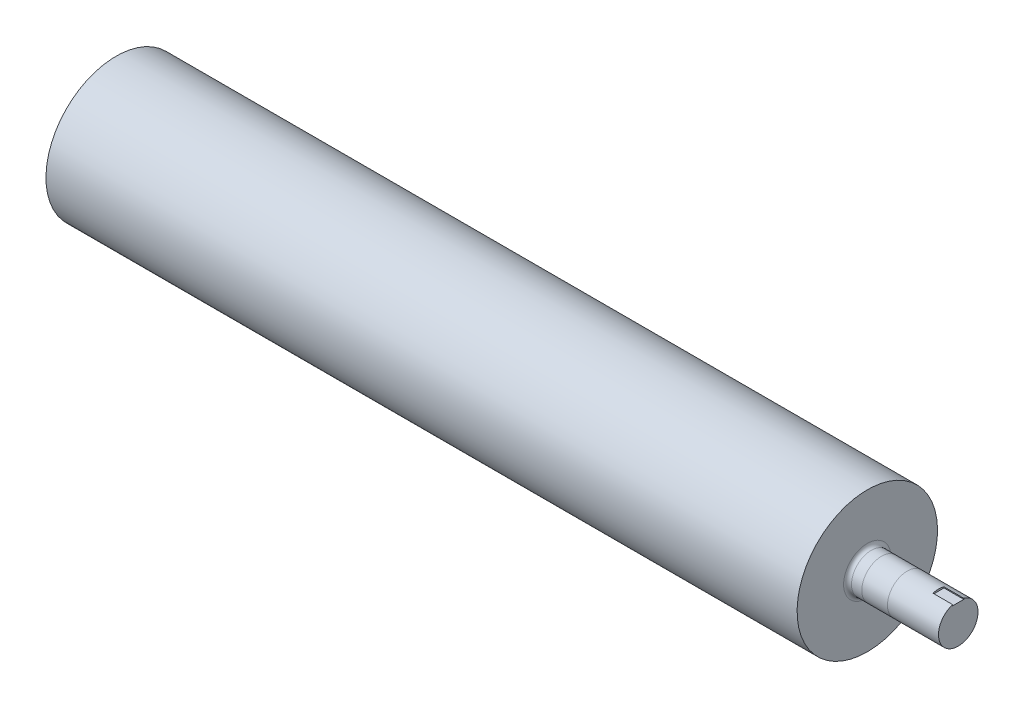
ISO-10303-21;
HEADER;
FILE_DESCRIPTION(('STEP AP214'),'2;1');
FILE_NAME('part.step','',(''),(''),'','','');
FILE_SCHEMA(('AUTOMOTIVE_DESIGN { 1 0 10303 214 1 1 1 1 }'));
ENDSEC;
DATA;
#1=APPLICATION_CONTEXT('core data for automotive mechanical design processes');
#2=APPLICATION_PROTOCOL_DEFINITION('international standard','automotive_design',2000,#1);
#3=PRODUCT_CONTEXT('',#1,'mechanical');
#4=PRODUCT('Part','Part','',(#3));
#5=PRODUCT_RELATED_PRODUCT_CATEGORY('part','',(#4));
#6=PRODUCT_DEFINITION_FORMATION('','',#4);
#7=PRODUCT_DEFINITION_CONTEXT('part definition',#1,'design');
#8=PRODUCT_DEFINITION('design','',#6,#7);
#9=PRODUCT_DEFINITION_SHAPE('','',#8);
#10=(LENGTH_UNIT() NAMED_UNIT(*) SI_UNIT(.MILLI.,.METRE.));
#11=(NAMED_UNIT(*) PLANE_ANGLE_UNIT() SI_UNIT($,.RADIAN.));
#12=(NAMED_UNIT(*) SI_UNIT($,.STERADIAN.) SOLID_ANGLE_UNIT());
#13=UNCERTAINTY_MEASURE_WITH_UNIT(LENGTH_MEASURE(1.E-05),#10,'distance_accuracy_value','');
#14=(GEOMETRIC_REPRESENTATION_CONTEXT(3) GLOBAL_UNCERTAINTY_ASSIGNED_CONTEXT((#13)) GLOBAL_UNIT_ASSIGNED_CONTEXT((#10,
#11,#12)) REPRESENTATION_CONTEXT('',''));
#15=CARTESIAN_POINT('',(0.,0.,0.));
#16=DIRECTION('',(0.,0.,1.));
#17=DIRECTION('',(1.,0.,0.));
#18=AXIS2_PLACEMENT_3D('',#15,#16,#17);
#19=CARTESIAN_POINT('',(-1040.,0.,0.));
#20=DIRECTION('',(-1.,0.,0.));
#21=DIRECTION('',(0.,-1.,0.));
#22=AXIS2_PLACEMENT_3D('',#19,#20,#21);
#23=CYLINDRICAL_SURFACE('',#22,50.);
#24=CARTESIAN_POINT('',(986.,0.,0.));
#25=DIRECTION('',(1.,0.,0.));
#26=DIRECTION('',(0.,1.,0.));
#27=AXIS2_PLACEMENT_3D('',#24,#25,#26);
#28=CIRCLE('',#27,50.);
#29=CARTESIAN_POINT('',(986.,50.,0.));
#30=VERTEX_POINT('',#29);
#31=EDGE_CURVE('E44',#30,#30,#28,.T.);
#32=ORIENTED_EDGE('',*,*,#31,.T.);
#33=EDGE_LOOP('',(#32));
#34=FACE_BOUND('',#33,.T.);
#35=CARTESIAN_POINT('',(1051.,0.,0.));
#36=DIRECTION('',(1.,0.,0.));
#37=DIRECTION('',(0.,0.,-1.));
#38=AXIS2_PLACEMENT_3D('',#35,#36,#37);
#39=CIRCLE('',#38,50.);
#40=CARTESIAN_POINT('',(1051.,0.,-50.));
#41=VERTEX_POINT('',#40);
#42=EDGE_CURVE('E11',#41,#41,#39,.T.);
#43=ORIENTED_EDGE('',*,*,#42,.F.);
#44=EDGE_LOOP('',(#43));
#45=FACE_BOUND('',#44,.T.);
#46=ADVANCED_FACE('F35',(#34,#45),#23,.T.);
#47=CARTESIAN_POINT('',(960.,0.,0.));
#48=DIRECTION('',(-1.,0.,0.));
#49=DIRECTION('',(0.,-1.,0.));
#50=AXIS2_PLACEMENT_3D('',#47,#48,#49);
#51=CIRCLE('',#50,50.);
#52=CARTESIAN_POINT('',(960.,-50.,0.));
#53=VERTEX_POINT('',#52);
#54=EDGE_CURVE('E122',#53,#53,#51,.F.);
#55=ORIENTED_EDGE('',*,*,#54,.T.);
#56=EDGE_LOOP('',(#55));
#57=FACE_BOUND('',#56,.T.);
#58=ORIENTED_EDGE('',*,*,#31,.F.);
#59=EDGE_LOOP('',(#58));
#60=FACE_BOUND('',#59,.T.);
#61=ADVANCED_FACE('F136',(#57,#60),#23,.T.);
#62=CARTESIAN_POINT('',(-1040.,0.,0.));
#63=DIRECTION('',(-1.,0.,0.));
#64=DIRECTION('',(0.,-1.,0.));
#65=AXIS2_PLACEMENT_3D('',#62,#63,#64);
#66=CYLINDRICAL_SURFACE('',#65,50.);
#67=CARTESIAN_POINT('',(-1040.,0.,0.));
#68=DIRECTION('',(-1.,0.,0.));
#69=DIRECTION('',(0.,-1.,0.));
#70=AXIS2_PLACEMENT_3D('',#67,#68,#69);
#71=CIRCLE('',#70,50.);
#72=CARTESIAN_POINT('',(-1040.,-50.,0.));
#73=VERTEX_POINT('',#72);
#74=EDGE_CURVE('E103',#73,#73,#71,.T.);
#75=ORIENTED_EDGE('',*,*,#74,.F.);
#76=EDGE_LOOP('',(#75));
#77=FACE_BOUND('',#76,.T.);
#78=CARTESIAN_POINT('',(-975.,0.,0.));
#79=DIRECTION('',(1.,0.,0.));
#80=DIRECTION('',(0.,1.,0.));
#81=AXIS2_PLACEMENT_3D('',#78,#79,#80);
#82=CIRCLE('',#81,50.);
#83=CARTESIAN_POINT('',(-975.,50.,0.));
#84=VERTEX_POINT('',#83);
#85=EDGE_CURVE('E125',#84,#84,#82,.T.);
#86=ORIENTED_EDGE('',*,*,#85,.F.);
#87=EDGE_LOOP('',(#86));
#88=FACE_BOUND('',#87,.T.);
#89=ADVANCED_FACE('F138',(#77,#88),#66,.T.);
#90=CARTESIAN_POINT('',(1180.,50.,0.));
#91=DIRECTION('',(-1.,0.,0.));
#92=DIRECTION('',(0.,-1.,0.));
#93=AXIS2_PLACEMENT_3D('',#90,#91,#92);
#94=PLANE('',#93);
#95=DIRECTION('',(0.,-1.,0.));
#96=VECTOR('',#95,1.);
#97=CARTESIAN_POINT('',(1180.,0.,-14.));
#98=LINE('',#97,#96);
#99=CARTESIAN_POINT('',(1180.,48.,-14.));
#100=VERTEX_POINT('',#99);
#101=CARTESIAN_POINT('',(1180.,45.4,-14.));
#102=VERTEX_POINT('',#101);
#103=EDGE_CURVE('E304',#100,#102,#98,.T.);
#104=ORIENTED_EDGE('',*,*,#103,.T.);
#105=DIRECTION('',(0.,0.,-1.));
#106=VECTOR('',#105,1.);
#107=CARTESIAN_POINT('',(1180.,45.4,0.));
#108=LINE('',#107,#106);
#109=CARTESIAN_POINT('',(1180.,45.4,14.));
#110=VERTEX_POINT('',#109);
#111=EDGE_CURVE('E301',#110,#102,#108,.T.);
#112=ORIENTED_EDGE('',*,*,#111,.F.);
#113=DIRECTION('',(0.,-1.,0.));
#114=VECTOR('',#113,1.);
#115=CARTESIAN_POINT('',(1180.,0.,14.));
#116=LINE('',#115,#114);
#117=CARTESIAN_POINT('',(1180.,48.,14.));
#118=VERTEX_POINT('',#117);
#119=EDGE_CURVE('E302',#118,#110,#116,.T.);
#120=ORIENTED_EDGE('',*,*,#119,.F.);
#121=CARTESIAN_POINT('',(1180.,0.,0.));
#122=DIRECTION('',(-1.,0.,0.));
#123=DIRECTION('',(0.,-1.,0.));
#124=AXIS2_PLACEMENT_3D('',#121,#122,#123);
#125=CIRCLE('',#124,50.);
#126=EDGE_CURVE('E96',#100,#118,#125,.T.);
#127=ORIENTED_EDGE('',*,*,#126,.F.);
#128=EDGE_LOOP('',(#104,#112,#120,#127));
#129=FACE_BOUND('',#128,.T.);
#130=ADVANCED_FACE('F145',(#129),#94,.F.);
#131=ORIENTED_EDGE('',*,*,#42,.T.);
#132=EDGE_LOOP('',(#131));
#133=FACE_BOUND('',#132,.T.);
#134=DIRECTION('',(1.,0.,0.));
#135=VECTOR('',#134,1.);
#136=CARTESIAN_POINT('',(1130.,48.,-14.));
#137=LINE('',#136,#135);
#138=CARTESIAN_POINT('',(1130.,48.,-14.));
#139=VERTEX_POINT('',#138);
#140=EDGE_CURVE('E97',#139,#100,#137,.T.);
#141=ORIENTED_EDGE('',*,*,#140,.T.);
#142=ORIENTED_EDGE('',*,*,#126,.T.);
#143=DIRECTION('',(1.,0.,0.));
#144=VECTOR('',#143,1.);
#145=CARTESIAN_POINT('',(1130.,48.,14.));
#146=LINE('',#145,#144);
#147=CARTESIAN_POINT('',(1130.,48.,14.));
#148=VERTEX_POINT('',#147);
#149=EDGE_CURVE('E81',#148,#118,#146,.T.);
#150=ORIENTED_EDGE('',*,*,#149,.F.);
#151=CARTESIAN_POINT('',(1130.,0.,0.));
#152=DIRECTION('',(1.,0.,0.));
#153=DIRECTION('',(0.,0.,-1.));
#154=AXIS2_PLACEMENT_3D('',#151,#152,#153);
#155=CIRCLE('',#154,50.);
#156=EDGE_CURVE('E86',#139,#148,#155,.T.);
#157=ORIENTED_EDGE('',*,*,#156,.F.);
#158=EDGE_LOOP('',(#141,#142,#150,#157));
#159=FACE_BOUND('',#158,.T.);
#160=ADVANCED_FACE('F94',(#133,#159),#23,.T.);
#161=CARTESIAN_POINT('',(950.,177.595701724125,0.));
#162=DIRECTION('',(-1.,0.,0.));
#163=DIRECTION('',(0.,-1.,0.));
#164=AXIS2_PLACEMENT_3D('',#161,#162,#163);
#165=PLANE('',#164);
#166=CARTESIAN_POINT('',(950.,0.,0.));
#167=DIRECTION('',(-1.,0.,0.));
#168=DIRECTION('',(0.,-1.,0.));
#169=AXIS2_PLACEMENT_3D('',#166,#167,#168);
#170=CIRCLE('',#169,60.);
#171=CARTESIAN_POINT('',(950.,-60.,0.));
#172=VERTEX_POINT('',#171);
#173=EDGE_CURVE('E119',#172,#172,#170,.T.);
#174=ORIENTED_EDGE('',*,*,#173,.T.);
#175=EDGE_LOOP('',(#174));
#176=FACE_BOUND('',#175,.T.);
#177=CARTESIAN_POINT('',(950.,0.,0.));
#178=DIRECTION('',(-1.,0.,0.));
#179=DIRECTION('',(0.,-1.,0.));
#180=AXIS2_PLACEMENT_3D('',#177,#178,#179);
#181=CIRCLE('',#180,177.595701724125);
#182=CARTESIAN_POINT('',(950.,-177.595701724125,0.));
#183=VERTEX_POINT('',#182);
#184=EDGE_CURVE('E109',#183,#183,#181,.T.);
#185=ORIENTED_EDGE('',*,*,#184,.F.);
#186=EDGE_LOOP('',(#185));
#187=FACE_BOUND('',#186,.T.);
#188=ADVANCED_FACE('F152',(#176,#187),#165,.F.);
#189=CARTESIAN_POINT('',(-1040.,0.,0.));
#190=DIRECTION('',(-1.,0.,0.));
#191=DIRECTION('',(0.,-1.,0.));
#192=AXIS2_PLACEMENT_3D('',#189,#190,#191);
#193=CYLINDRICAL_SURFACE('',#192,177.595701724125);
#194=CARTESIAN_POINT('',(-950.,0.,0.));
#195=DIRECTION('',(-1.,0.,0.));
#196=DIRECTION('',(0.,-1.,0.));
#197=AXIS2_PLACEMENT_3D('',#194,#195,#196);
#198=CIRCLE('',#197,177.595701724125);
#199=CARTESIAN_POINT('',(-950.,-177.595701724125,0.));
#200=VERTEX_POINT('',#199);
#201=EDGE_CURVE('E106',#200,#200,#198,.T.);
#202=ORIENTED_EDGE('',*,*,#201,.F.);
#203=EDGE_LOOP('',(#202));
#204=FACE_BOUND('',#203,.T.);
#205=ORIENTED_EDGE('',*,*,#184,.T.);
#206=EDGE_LOOP('',(#205));
#207=FACE_BOUND('',#206,.T.);
#208=ADVANCED_FACE('F158',(#204,#207),#193,.T.);
#209=CARTESIAN_POINT('',(-950.,50.,0.));
#210=DIRECTION('',(1.,0.,0.));
#211=DIRECTION('',(0.,1.,0.));
#212=AXIS2_PLACEMENT_3D('',#209,#210,#211);
#213=PLANE('',#212);
#214=CARTESIAN_POINT('',(-950.,0.,0.));
#215=DIRECTION('',(1.,0.,0.));
#216=DIRECTION('',(0.,1.,0.));
#217=AXIS2_PLACEMENT_3D('',#214,#215,#216);
#218=CIRCLE('',#217,60.);
#219=CARTESIAN_POINT('',(-950.,60.,0.));
#220=VERTEX_POINT('',#219);
#221=EDGE_CURVE('E116',#220,#220,#218,.T.);
#222=ORIENTED_EDGE('',*,*,#221,.T.);
#223=EDGE_LOOP('',(#222));
#224=FACE_BOUND('',#223,.T.);
#225=ORIENTED_EDGE('',*,*,#201,.T.);
#226=EDGE_LOOP('',(#225));
#227=FACE_BOUND('',#226,.T.);
#228=ADVANCED_FACE('F182',(#224,#227),#213,.F.);
#229=ORIENTED_EDGE('',*,*,#85,.T.);
#230=EDGE_LOOP('',(#229));
#231=FACE_BOUND('',#230,.T.);
#232=CARTESIAN_POINT('',(-960.,0.,0.));
#233=DIRECTION('',(1.,0.,0.));
#234=DIRECTION('',(0.,1.,0.));
#235=AXIS2_PLACEMENT_3D('',#232,#233,#234);
#236=CIRCLE('',#235,50.);
#237=CARTESIAN_POINT('',(-960.,50.,0.));
#238=VERTEX_POINT('',#237);
#239=EDGE_CURVE('E113',#238,#238,#236,.F.);
#240=ORIENTED_EDGE('',*,*,#239,.T.);
#241=EDGE_LOOP('',(#240));
#242=FACE_BOUND('',#241,.T.);
#243=ADVANCED_FACE('F148',(#231,#242),#66,.T.);
#244=CARTESIAN_POINT('',(-1040.,0.,0.));
#245=DIRECTION('',(1.,0.,0.));
#246=DIRECTION('',(0.,1.,0.));
#247=AXIS2_PLACEMENT_3D('',#244,#245,#246);
#248=PLANE('',#247);
#249=ORIENTED_EDGE('',*,*,#74,.T.);
#250=EDGE_LOOP('',(#249));
#251=FACE_BOUND('',#250,.T.);
#252=ADVANCED_FACE('F167',(#251),#248,.F.);
#253=CARTESIAN_POINT('',(-960.,0.,0.));
#254=DIRECTION('',(1.,0.,0.));
#255=DIRECTION('',(0.,1.,0.));
#256=AXIS2_PLACEMENT_3D('',#253,#254,#255);
#257=TOROIDAL_SURFACE('',#256,60.,10.);
#258=ORIENTED_EDGE('',*,*,#221,.F.);
#259=EDGE_LOOP('',(#258));
#260=FACE_BOUND('',#259,.T.);
#261=ORIENTED_EDGE('',*,*,#239,.F.);
#262=EDGE_LOOP('',(#261));
#263=FACE_BOUND('',#262,.T.);
#264=ADVANCED_FACE('F165',(#260,#263),#257,.F.);
#265=CARTESIAN_POINT('',(960.,0.,0.));
#266=DIRECTION('',(-1.,0.,0.));
#267=DIRECTION('',(0.,-1.,0.));
#268=AXIS2_PLACEMENT_3D('',#265,#266,#267);
#269=TOROIDAL_SURFACE('',#268,60.,10.);
#270=ORIENTED_EDGE('',*,*,#54,.F.);
#271=EDGE_LOOP('',(#270));
#272=FACE_BOUND('',#271,.T.);
#273=ORIENTED_EDGE('',*,*,#173,.F.);
#274=EDGE_LOOP('',(#273));
#275=FACE_BOUND('',#274,.T.);
#276=ADVANCED_FACE('F37',(#272,#275),#269,.F.);
#277=CARTESIAN_POINT('',(1130.,0.,-14.));
#278=DIRECTION('',(0.,0.,1.));
#279=DIRECTION('',(1.,0.,0.));
#280=AXIS2_PLACEMENT_3D('',#277,#278,#279);
#281=PLANE('',#280);
#282=ORIENTED_EDGE('',*,*,#103,.F.);
#283=ORIENTED_EDGE('',*,*,#140,.F.);
#284=DIRECTION('',(0.,-1.,0.));
#285=VECTOR('',#284,1.);
#286=CARTESIAN_POINT('',(1130.,0.,-14.));
#287=LINE('',#286,#285);
#288=CARTESIAN_POINT('',(1130.,45.4,-14.));
#289=VERTEX_POINT('',#288);
#290=EDGE_CURVE('E51',#139,#289,#287,.T.);
#291=ORIENTED_EDGE('',*,*,#290,.T.);
#292=DIRECTION('',(1.,0.,0.));
#293=VECTOR('',#292,1.);
#294=CARTESIAN_POINT('',(1130.,45.4,-14.));
#295=LINE('',#294,#293);
#296=EDGE_CURVE('E72',#289,#102,#295,.T.);
#297=ORIENTED_EDGE('',*,*,#296,.T.);
#298=EDGE_LOOP('',(#282,#283,#291,#297));
#299=FACE_BOUND('',#298,.T.);
#300=ADVANCED_FACE('F173',(#299),#281,.T.);
#301=CARTESIAN_POINT('',(1130.,45.4,0.));
#302=DIRECTION('',(0.,-1.,0.));
#303=DIRECTION('',(1.,0.,0.));
#304=AXIS2_PLACEMENT_3D('',#301,#302,#303);
#305=PLANE('',#304);
#306=ORIENTED_EDGE('',*,*,#111,.T.);
#307=ORIENTED_EDGE('',*,*,#296,.F.);
#308=DIRECTION('',(0.,0.,-1.));
#309=VECTOR('',#308,1.);
#310=CARTESIAN_POINT('',(1130.,45.4,0.));
#311=LINE('',#310,#309);
#312=CARTESIAN_POINT('',(1130.,45.4,14.));
#313=VERTEX_POINT('',#312);
#314=EDGE_CURVE('E85',#313,#289,#311,.T.);
#315=ORIENTED_EDGE('',*,*,#314,.F.);
#316=DIRECTION('',(1.,0.,0.));
#317=VECTOR('',#316,1.);
#318=CARTESIAN_POINT('',(1130.,45.4,14.));
#319=LINE('',#318,#317);
#320=EDGE_CURVE('E83',#313,#110,#319,.T.);
#321=ORIENTED_EDGE('',*,*,#320,.T.);
#322=EDGE_LOOP('',(#306,#307,#315,#321));
#323=FACE_BOUND('',#322,.T.);
#324=ADVANCED_FACE('F233',(#323),#305,.F.);
#325=CARTESIAN_POINT('',(1130.,0.,14.));
#326=DIRECTION('',(0.,0.,1.));
#327=DIRECTION('',(1.,0.,0.));
#328=AXIS2_PLACEMENT_3D('',#325,#326,#327);
#329=PLANE('',#328);
#330=ORIENTED_EDGE('',*,*,#119,.T.);
#331=ORIENTED_EDGE('',*,*,#320,.F.);
#332=DIRECTION('',(0.,-1.,0.));
#333=VECTOR('',#332,1.);
#334=CARTESIAN_POINT('',(1130.,0.,14.));
#335=LINE('',#334,#333);
#336=EDGE_CURVE('E77',#148,#313,#335,.T.);
#337=ORIENTED_EDGE('',*,*,#336,.F.);
#338=ORIENTED_EDGE('',*,*,#149,.T.);
#339=EDGE_LOOP('',(#330,#331,#337,#338));
#340=FACE_BOUND('',#339,.T.);
#341=ADVANCED_FACE('F79',(#340),#329,.F.);
#342=CARTESIAN_POINT('',(1130.,0.,0.));
#343=DIRECTION('',(1.,0.,0.));
#344=DIRECTION('',(0.,0.,-1.));
#345=AXIS2_PLACEMENT_3D('',#342,#343,#344);
#346=PLANE('',#345);
#347=ORIENTED_EDGE('',*,*,#290,.F.);
#348=ORIENTED_EDGE('',*,*,#156,.T.);
#349=ORIENTED_EDGE('',*,*,#336,.T.);
#350=ORIENTED_EDGE('',*,*,#314,.T.);
#351=EDGE_LOOP('',(#347,#348,#349,#350));
#352=FACE_BOUND('',#351,.T.);
#353=ADVANCED_FACE('F89',(#352),#346,.T.);
#354=CLOSED_SHELL('',(#46,#61,#89,#130,#160,#188,#208,#228,#243,#252,#264,#276,#300,#324,#341,#353));
#355=MANIFOLD_SOLID_BREP('B2',#354);
#356=ADVANCED_BREP_SHAPE_REPRESENTATION('',(#18,#355),#14);
#357=SHAPE_DEFINITION_REPRESENTATION(#9,#356);
ENDSEC;
END-ISO-10303-21;
